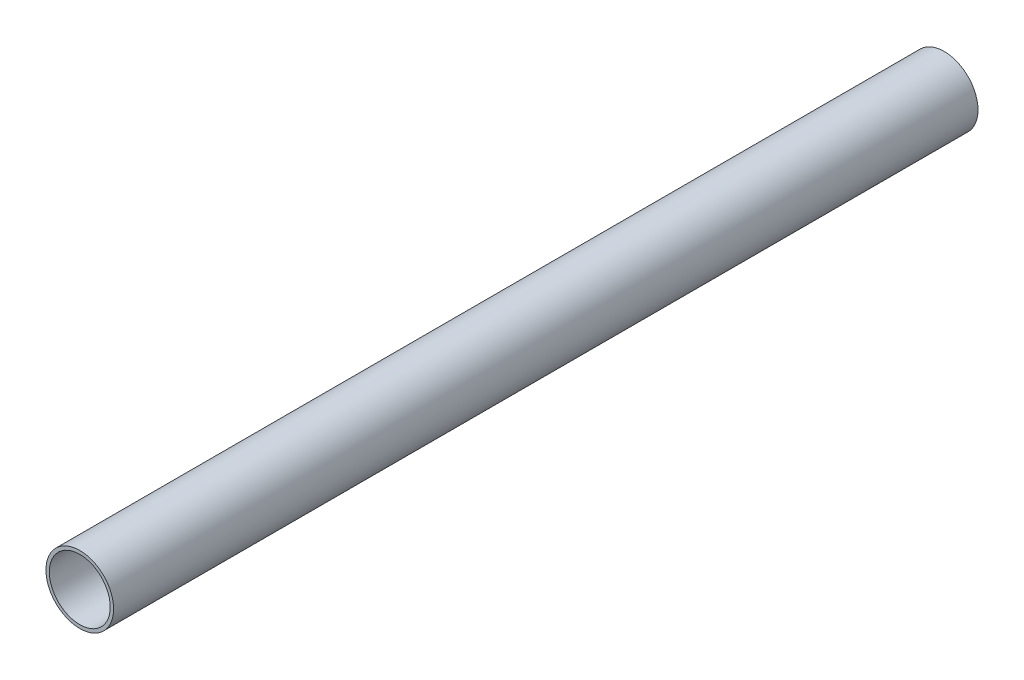
ISO-10303-21;
HEADER;
FILE_DESCRIPTION(('STEP AP214'),'2;1');
FILE_NAME('part.step','',(''),(''),'','','');
FILE_SCHEMA(('AUTOMOTIVE_DESIGN { 1 0 10303 214 1 1 1 1 }'));
ENDSEC;
DATA;
#1=APPLICATION_CONTEXT('core data for automotive mechanical design processes');
#2=APPLICATION_PROTOCOL_DEFINITION('international standard','automotive_design',2000,#1);
#3=PRODUCT_CONTEXT('',#1,'mechanical');
#4=PRODUCT('Part','Part','',(#3));
#5=PRODUCT_RELATED_PRODUCT_CATEGORY('part','',(#4));
#6=PRODUCT_DEFINITION_FORMATION('','',#4);
#7=PRODUCT_DEFINITION_CONTEXT('part definition',#1,'design');
#8=PRODUCT_DEFINITION('design','',#6,#7);
#9=PRODUCT_DEFINITION_SHAPE('','',#8);
#10=(LENGTH_UNIT() NAMED_UNIT(*) SI_UNIT(.MILLI.,.METRE.));
#11=(NAMED_UNIT(*) PLANE_ANGLE_UNIT() SI_UNIT($,.RADIAN.));
#12=(NAMED_UNIT(*) SI_UNIT($,.STERADIAN.) SOLID_ANGLE_UNIT());
#13=UNCERTAINTY_MEASURE_WITH_UNIT(LENGTH_MEASURE(1.E-05),#10,'distance_accuracy_value','');
#14=(GEOMETRIC_REPRESENTATION_CONTEXT(3) GLOBAL_UNCERTAINTY_ASSIGNED_CONTEXT((#13)) GLOBAL_UNIT_ASSIGNED_CONTEXT((#10,
#11,#12)) REPRESENTATION_CONTEXT('',''));
#15=CARTESIAN_POINT('',(0.,0.,0.));
#16=DIRECTION('',(0.,0.,1.));
#17=DIRECTION('',(1.,0.,0.));
#18=AXIS2_PLACEMENT_3D('',#15,#16,#17);
#19=CARTESIAN_POINT('',(372.712412999575,292.229711235467,202.781650062));
#20=DIRECTION('',(0.,0.,1.));
#21=DIRECTION('',(1.,0.,0.));
#22=AXIS2_PLACEMENT_3D('',#19,#20,#21);
#23=PLANE('',#22);
#24=CARTESIAN_POINT('',(372.712412999575,292.229711235467,202.781650062));
#25=DIRECTION('',(0.,0.,1.));
#26=DIRECTION('',(1.,0.,0.));
#27=AXIS2_PLACEMENT_3D('',#24,#25,#26);
#28=CIRCLE('',#27,15.875);
#29=CARTESIAN_POINT('',(388.587412999575,292.229711235467,202.781650062));
#30=VERTEX_POINT('',#29);
#31=EDGE_CURVE('E11',#30,#30,#28,.T.);
#32=ORIENTED_EDGE('',*,*,#31,.T.);
#33=EDGE_LOOP('',(#32));
#34=FACE_BOUND('',#33,.T.);
#35=CARTESIAN_POINT('',(372.712412999575,292.229711235467,202.781650062));
#36=DIRECTION('',(0.,0.,1.));
#37=DIRECTION('',(1.,0.,0.));
#38=AXIS2_PLACEMENT_3D('',#35,#36,#37);
#39=CIRCLE('',#38,14.2875);
#40=CARTESIAN_POINT('',(386.999912999575,292.229711235467,202.781650062));
#41=VERTEX_POINT('',#40);
#42=EDGE_CURVE('E52',#41,#41,#39,.T.);
#43=ORIENTED_EDGE('',*,*,#42,.F.);
#44=EDGE_LOOP('',(#43));
#45=FACE_BOUND('',#44,.T.);
#46=ADVANCED_FACE('F41',(#34,#45),#23,.T.);
#47=CARTESIAN_POINT('',(372.712412999575,292.229711235467,-202.781650062));
#48=DIRECTION('',(0.,0.,1.));
#49=DIRECTION('',(1.,0.,0.));
#50=AXIS2_PLACEMENT_3D('',#47,#48,#49);
#51=PLANE('',#50);
#52=CARTESIAN_POINT('',(372.712412999575,292.229711235467,-202.781650062));
#53=DIRECTION('',(0.,0.,1.));
#54=DIRECTION('',(1.,0.,0.));
#55=AXIS2_PLACEMENT_3D('',#52,#53,#54);
#56=CIRCLE('',#55,15.875);
#57=CARTESIAN_POINT('',(388.587412999575,292.229711235467,-202.781650062));
#58=VERTEX_POINT('',#57);
#59=EDGE_CURVE('E45',#58,#58,#56,.T.);
#60=ORIENTED_EDGE('',*,*,#59,.F.);
#61=EDGE_LOOP('',(#60));
#62=FACE_BOUND('',#61,.T.);
#63=CARTESIAN_POINT('',(372.712412999575,292.229711235467,-202.781650062));
#64=DIRECTION('',(0.,0.,1.));
#65=DIRECTION('',(1.,0.,0.));
#66=AXIS2_PLACEMENT_3D('',#63,#64,#65);
#67=CIRCLE('',#66,14.2875);
#68=CARTESIAN_POINT('',(386.999912999575,292.229711235467,-202.781650062));
#69=VERTEX_POINT('',#68);
#70=EDGE_CURVE('E54',#69,#69,#67,.T.);
#71=ORIENTED_EDGE('',*,*,#70,.T.);
#72=EDGE_LOOP('',(#71));
#73=FACE_BOUND('',#72,.T.);
#74=ADVANCED_FACE('F64',(#62,#73),#51,.F.);
#75=CARTESIAN_POINT('',(372.712412999575,292.229711235467,202.781650062));
#76=DIRECTION('',(0.,0.,-1.));
#77=DIRECTION('',(-1.,0.,0.));
#78=AXIS2_PLACEMENT_3D('',#75,#76,#77);
#79=CYLINDRICAL_SURFACE('',#78,15.875);
#80=ORIENTED_EDGE('',*,*,#31,.F.);
#81=EDGE_LOOP('',(#80));
#82=FACE_BOUND('',#81,.T.);
#83=ORIENTED_EDGE('',*,*,#59,.T.);
#84=EDGE_LOOP('',(#83));
#85=FACE_BOUND('',#84,.T.);
#86=ADVANCED_FACE('F43',(#82,#85),#79,.T.);
#87=CARTESIAN_POINT('',(372.712412999575,292.229711235467,202.781650062));
#88=DIRECTION('',(0.,0.,-1.));
#89=DIRECTION('',(-1.,0.,0.));
#90=AXIS2_PLACEMENT_3D('',#87,#88,#89);
#91=CYLINDRICAL_SURFACE('',#90,14.2875);
#92=ORIENTED_EDGE('',*,*,#42,.T.);
#93=EDGE_LOOP('',(#92));
#94=FACE_BOUND('',#93,.T.);
#95=ORIENTED_EDGE('',*,*,#70,.F.);
#96=EDGE_LOOP('',(#95));
#97=FACE_BOUND('',#96,.T.);
#98=ADVANCED_FACE('F60',(#94,#97),#91,.F.);
#99=CLOSED_SHELL('',(#46,#74,#86,#98));
#100=MANIFOLD_SOLID_BREP('B2',#99);
#101=ADVANCED_BREP_SHAPE_REPRESENTATION('',(#18,#100),#14);
#102=SHAPE_DEFINITION_REPRESENTATION(#9,#101);
ENDSEC;
END-ISO-10303-21;
